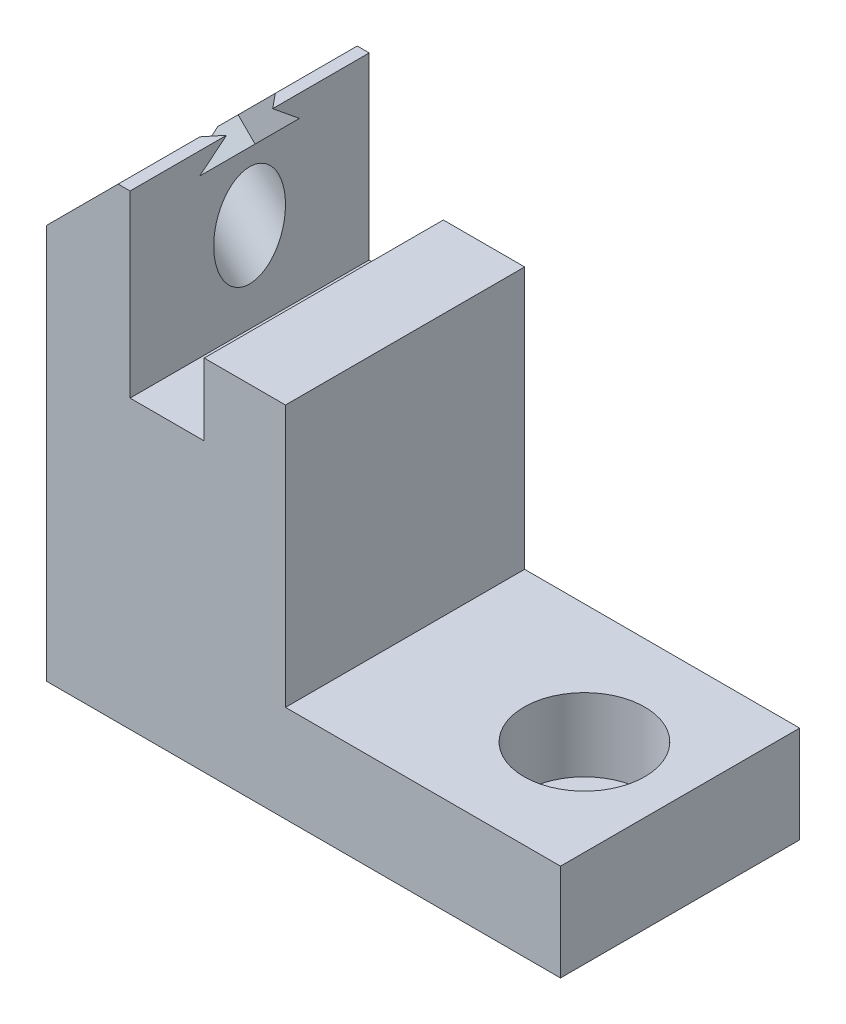
ISO-10303-21;
HEADER;
FILE_DESCRIPTION(('STEP AP214'),'2;1');
FILE_NAME('part.step','',(''),(''),'','','');
FILE_SCHEMA(('AUTOMOTIVE_DESIGN { 1 0 10303 214 1 1 1 1 }'));
ENDSEC;
DATA;
#1=APPLICATION_CONTEXT('core data for automotive mechanical design processes');
#2=APPLICATION_PROTOCOL_DEFINITION('international standard','automotive_design',2000,#1);
#3=PRODUCT_CONTEXT('',#1,'mechanical');
#4=PRODUCT('Part','Part','',(#3));
#5=PRODUCT_RELATED_PRODUCT_CATEGORY('part','',(#4));
#6=PRODUCT_DEFINITION_FORMATION('','',#4);
#7=PRODUCT_DEFINITION_CONTEXT('part definition',#1,'design');
#8=PRODUCT_DEFINITION('design','',#6,#7);
#9=PRODUCT_DEFINITION_SHAPE('','',#8);
#10=(LENGTH_UNIT() NAMED_UNIT(*) SI_UNIT(.MILLI.,.METRE.));
#11=(NAMED_UNIT(*) PLANE_ANGLE_UNIT() SI_UNIT($,.RADIAN.));
#12=(NAMED_UNIT(*) SI_UNIT($,.STERADIAN.) SOLID_ANGLE_UNIT());
#13=UNCERTAINTY_MEASURE_WITH_UNIT(LENGTH_MEASURE(1.E-05),#10,'distance_accuracy_value','');
#14=(GEOMETRIC_REPRESENTATION_CONTEXT(3) GLOBAL_UNCERTAINTY_ASSIGNED_CONTEXT((#13)) GLOBAL_UNIT_ASSIGNED_CONTEXT((#10,
#11,#12)) REPRESENTATION_CONTEXT('',''));
#15=CARTESIAN_POINT('',(0.,0.,0.));
#16=DIRECTION('',(0.,0.,1.));
#17=DIRECTION('',(1.,0.,0.));
#18=AXIS2_PLACEMENT_3D('',#15,#16,#17);
#19=CARTESIAN_POINT('',(25.,21.001,0.));
#20=DIRECTION('',(0.,-1.,0.));
#21=DIRECTION('',(0.,0.,-1.));
#22=AXIS2_PLACEMENT_3D('',#19,#20,#21);
#23=CYLINDRICAL_SURFACE('',#22,3.);
#24=CARTESIAN_POINT('',(25.,-18.,0.));
#25=DIRECTION('',(0.,-1.,0.));
#26=DIRECTION('',(0.,0.,-1.));
#27=AXIS2_PLACEMENT_3D('',#24,#25,#26);
#28=CIRCLE('',#27,3.);
#29=CARTESIAN_POINT('',(25.,-18.,-3.));
#30=VERTEX_POINT('',#29);
#31=EDGE_CURVE('E246',#30,#30,#28,.T.);
#32=ORIENTED_EDGE('',*,*,#31,.T.);
#33=EDGE_LOOP('',(#32));
#34=FACE_BOUND('',#33,.T.);
#35=CARTESIAN_POINT('',(25.,-16.,0.));
#36=DIRECTION('',(0.,1.,0.));
#37=DIRECTION('',(0.,0.,1.));
#38=AXIS2_PLACEMENT_3D('',#35,#36,#37);
#39=CIRCLE('',#38,3.);
#40=CARTESIAN_POINT('',(25.,-16.,3.));
#41=VERTEX_POINT('',#40);
#42=EDGE_CURVE('E43',#41,#41,#39,.F.);
#43=ORIENTED_EDGE('',*,*,#42,.F.);
#44=EDGE_LOOP('',(#43));
#45=FACE_BOUND('',#44,.T.);
#46=ADVANCED_FACE('F39',(#34,#45),#23,.F.);
#47=CARTESIAN_POINT('',(10.,6.,10.));
#48=DIRECTION('',(-1.,0.,0.));
#49=DIRECTION('',(0.,0.,1.));
#50=AXIS2_PLACEMENT_3D('',#47,#48,#49);
#51=PLANE('',#50);
#52=DIRECTION('',(0.,0.,1.));
#53=VECTOR('',#52,1.);
#54=CARTESIAN_POINT('',(10.,-9.9,10.));
#55=LINE('',#54,#53);
#56=CARTESIAN_POINT('',(10.,-9.9,-10.));
#57=VERTEX_POINT('',#56);
#58=CARTESIAN_POINT('',(10.,-9.9,10.));
#59=VERTEX_POINT('',#58);
#60=EDGE_CURVE('E57',#57,#59,#55,.T.);
#61=ORIENTED_EDGE('',*,*,#60,.F.);
#62=DIRECTION('',(0.,-1.,0.));
#63=VECTOR('',#62,1.);
#64=CARTESIAN_POINT('',(10.,6.,-10.));
#65=LINE('',#64,#63);
#66=CARTESIAN_POINT('',(10.,12.,-10.));
#67=VERTEX_POINT('',#66);
#68=EDGE_CURVE('E491',#67,#57,#65,.T.);
#69=ORIENTED_EDGE('',*,*,#68,.F.);
#70=DIRECTION('',(0.,0.,-1.));
#71=VECTOR('',#70,1.);
#72=CARTESIAN_POINT('',(10.,12.,10.));
#73=LINE('',#72,#71);
#74=CARTESIAN_POINT('',(10.,12.,10.));
#75=VERTEX_POINT('',#74);
#76=EDGE_CURVE('E459',#75,#67,#73,.T.);
#77=ORIENTED_EDGE('',*,*,#76,.F.);
#78=DIRECTION('',(0.,-1.,0.));
#79=VECTOR('',#78,1.);
#80=CARTESIAN_POINT('',(10.,6.,10.));
#81=LINE('',#80,#79);
#82=EDGE_CURVE('E483',#75,#59,#81,.T.);
#83=ORIENTED_EDGE('',*,*,#82,.T.);
#84=EDGE_LOOP('',(#61,#69,#77,#83));
#85=FACE_BOUND('',#84,.T.);
#86=ADVANCED_FACE('F532',(#85),#51,.F.);
#87=CARTESIAN_POINT('',(0.,21.,0.));
#88=DIRECTION('',(0.,-1.,0.));
#89=DIRECTION('',(0.,0.,-1.));
#90=AXIS2_PLACEMENT_3D('',#87,#88,#89);
#91=PLANE('',#90);
#92=DIRECTION('',(0.,0.,-1.));
#93=VECTOR('',#92,1.);
#94=CARTESIAN_POINT('',(-3.,21.,10.));
#95=LINE('',#94,#93);
#96=CARTESIAN_POINT('',(-3.,21.,10.));
#97=VERTEX_POINT('',#96);
#98=CARTESIAN_POINT('',(-3.,21.,1.92808109443833));
#99=VERTEX_POINT('',#98);
#100=EDGE_CURVE('E431',#97,#99,#95,.T.);
#101=ORIENTED_EDGE('',*,*,#100,.T.);
#102=DIRECTION('',(-0.632455532033677,0.,0.774596669241483));
#103=VECTOR('',#102,1.);
#104=CARTESIAN_POINT('',(-0.85543702718383,21.,-0.698461407894577));
#105=LINE('',#104,#103);
#106=CARTESIAN_POINT('',(-4.00000000000001,21.,3.15282596582992));
#107=VERTEX_POINT('',#106);
#108=EDGE_CURVE('E410',#99,#107,#105,.T.);
#109=ORIENTED_EDGE('',*,*,#108,.T.);
#110=DIRECTION('',(0.,0.,1.));
#111=VECTOR('',#110,1.);
#112=CARTESIAN_POINT('',(-4.00000000000001,21.,0.));
#113=LINE('',#112,#111);
#114=CARTESIAN_POINT('',(-4.00000000000001,21.,10.));
#115=VERTEX_POINT('',#114);
#116=EDGE_CURVE('E494',#107,#115,#113,.T.);
#117=ORIENTED_EDGE('',*,*,#116,.T.);
#118=DIRECTION('',(1.,0.,0.));
#119=VECTOR('',#118,1.);
#120=CARTESIAN_POINT('',(-10.,21.,10.));
#121=LINE('',#120,#119);
#122=EDGE_CURVE('E427',#115,#97,#121,.T.);
#123=ORIENTED_EDGE('',*,*,#122,.T.);
#124=EDGE_LOOP('',(#101,#109,#117,#123));
#125=FACE_BOUND('',#124,.T.);
#126=ADVANCED_FACE('F538',(#125),#91,.F.);
#127=CARTESIAN_POINT('',(-4.00000000000001,21.,0.));
#128=DIRECTION('',(0.707106781186549,-0.707106781186546,0.));
#129=DIRECTION('',(0.,0.,1.));
#130=AXIS2_PLACEMENT_3D('',#127,#128,#129);
#131=PLANE('',#130);
#132=DIRECTION('',(0.353553390593273,0.353553390593274,-0.866025403784439));
#133=VECTOR('',#132,1.);
#134=CARTESIAN_POINT('',(-4.97864220139431,20.0213577986057,5.55));
#135=LINE('',#134,#133);
#136=CARTESIAN_POINT('',(-4.97864220139431,20.0213577986057,5.55));
#137=VERTEX_POINT('',#136);
#138=EDGE_CURVE('E331',#137,#107,#135,.T.);
#139=ORIENTED_EDGE('',*,*,#138,.F.);
#140=DIRECTION('',(0.707106781186546,0.707106781186549,0.));
#141=VECTOR('',#140,1.);
#142=CARTESIAN_POINT('',(-9.51019822554318,15.4898017744568,5.55));
#143=LINE('',#142,#141);
#144=CARTESIAN_POINT('',(-9.51019822554318,15.4898017744568,5.55));
#145=VERTEX_POINT('',#144);
#146=EDGE_CURVE('E337',#145,#137,#143,.T.);
#147=ORIENTED_EDGE('',*,*,#146,.F.);
#148=DIRECTION('',(0.353553390593273,0.353553390593274,0.866025403784439));
#149=VECTOR('',#148,1.);
#150=CARTESIAN_POINT('',(-11.7759762376176,13.2240237623824,0.));
#151=LINE('',#150,#149);
#152=CARTESIAN_POINT('',(-10.,15.,4.350235577471));
#153=VERTEX_POINT('',#152);
#154=EDGE_CURVE('E368',#153,#145,#151,.T.);
#155=ORIENTED_EDGE('',*,*,#154,.F.);
#156=DIRECTION('',(0.,0.,-1.));
#157=VECTOR('',#156,1.);
#158=CARTESIAN_POINT('',(-10.,15.,10.));
#159=LINE('',#158,#157);
#160=CARTESIAN_POINT('',(-10.,15.,10.));
#161=VERTEX_POINT('',#160);
#162=EDGE_CURVE('E49',#161,#153,#159,.T.);
#163=ORIENTED_EDGE('',*,*,#162,.F.);
#164=DIRECTION('',(0.707106781186546,0.707106781186549,0.));
#165=VECTOR('',#164,1.);
#166=CARTESIAN_POINT('',(-4.00000000000001,21.,10.));
#167=LINE('',#166,#165);
#168=EDGE_CURVE('E499',#115,#161,#167,.F.);
#169=ORIENTED_EDGE('',*,*,#168,.F.);
#170=ORIENTED_EDGE('',*,*,#116,.F.);
#171=EDGE_LOOP('',(#139,#147,#155,#163,#169,#170));
#172=FACE_BOUND('',#171,.T.);
#173=ADVANCED_FACE('F770',(#172),#131,.F.);
#174=CARTESIAN_POINT('',(-0.173352401603255,10.6845119746658,0.));
#175=DIRECTION('',(-0.707106781186549,0.707106781186546,0.));
#176=DIRECTION('',(-0.707106781186546,-0.707106781186549,0.));
#177=AXIS2_PLACEMENT_3D('',#174,#175,#176);
#178=CYLINDRICAL_SURFACE('',#177,3.);
#179=CARTESIAN_POINT('',(-3.,13.5111595730625,0.));
#180=DIRECTION('',(-1.,0.,0.));
#181=DIRECTION('',(0.,1.,0.));
#182=AXIS2_PLACEMENT_3D('',#179,#180,#181);
#183=ELLIPSE('',#182,4.24264068711928,3.);
#184=CARTESIAN_POINT('',(-3.,17.7538002601818,0.));
#185=VERTEX_POINT('',#184);
#186=EDGE_CURVE('E227',#185,#185,#183,.T.);
#187=ORIENTED_EDGE('',*,*,#186,.F.);
#188=EDGE_LOOP('',(#187));
#189=FACE_BOUND('',#188,.T.);
#190=CARTESIAN_POINT('',(-5.83020665109565,16.3413662241582,0.));
#191=DIRECTION('',(-0.707106781186549,0.707106781186546,0.));
#192=DIRECTION('',(-0.707106781186546,-0.707106781186549,0.));
#193=AXIS2_PLACEMENT_3D('',#190,#191,#192);
#194=CIRCLE('',#193,3.);
#195=CARTESIAN_POINT('',(-7.95152699465529,14.2200458805985,0.));
#196=VERTEX_POINT('',#195);
#197=EDGE_CURVE('E377',#196,#196,#194,.F.);
#198=ORIENTED_EDGE('',*,*,#197,.F.);
#199=EDGE_LOOP('',(#198));
#200=FACE_BOUND('',#199,.T.);
#201=ADVANCED_FACE('F820',(#189,#200),#178,.F.);
#202=CARTESIAN_POINT('',(0.,6.,0.));
#203=DIRECTION('',(0.,-1.,0.));
#204=DIRECTION('',(0.,0.,-1.));
#205=AXIS2_PLACEMENT_3D('',#202,#203,#204);
#206=PLANE('',#205);
#207=DIRECTION('',(0.,0.,-1.));
#208=VECTOR('',#207,1.);
#209=CARTESIAN_POINT('',(-3.,6.,10.));
#210=LINE('',#209,#208);
#211=CARTESIAN_POINT('',(-3.,6.,10.));
#212=VERTEX_POINT('',#211);
#213=CARTESIAN_POINT('',(-3.,6.,-10.));
#214=VERTEX_POINT('',#213);
#215=EDGE_CURVE('E426',#212,#214,#210,.T.);
#216=ORIENTED_EDGE('',*,*,#215,.F.);
#217=DIRECTION('',(1.,0.,0.));
#218=VECTOR('',#217,1.);
#219=CARTESIAN_POINT('',(-10.,6.,10.));
#220=LINE('',#219,#218);
#221=CARTESIAN_POINT('',(3.2,6.,10.));
#222=VERTEX_POINT('',#221);
#223=EDGE_CURVE('E480',#212,#222,#220,.T.);
#224=ORIENTED_EDGE('',*,*,#223,.T.);
#225=DIRECTION('',(0.,0.,1.));
#226=VECTOR('',#225,1.);
#227=CARTESIAN_POINT('',(3.2,6.,10.));
#228=LINE('',#227,#226);
#229=CARTESIAN_POINT('',(3.2,6.,-10.));
#230=VERTEX_POINT('',#229);
#231=EDGE_CURVE('E450',#230,#222,#228,.T.);
#232=ORIENTED_EDGE('',*,*,#231,.F.);
#233=DIRECTION('',(-1.,0.,0.));
#234=VECTOR('',#233,1.);
#235=CARTESIAN_POINT('',(-10.,6.,-10.));
#236=LINE('',#235,#234);
#237=EDGE_CURVE('E477',#230,#214,#236,.T.);
#238=ORIENTED_EDGE('',*,*,#237,.T.);
#239=EDGE_LOOP('',(#216,#224,#232,#238));
#240=FACE_BOUND('',#239,.T.);
#241=ADVANCED_FACE('F649',(#240),#206,.F.);
#242=CARTESIAN_POINT('',(-10.,6.,-10.));
#243=DIRECTION('',(0.,0.,1.));
#244=DIRECTION('',(1.,0.,0.));
#245=AXIS2_PLACEMENT_3D('',#242,#243,#244);
#246=PLANE('',#245);
#247=DIRECTION('',(0.,-1.,0.));
#248=VECTOR('',#247,1.);
#249=CARTESIAN_POINT('',(-10.,6.,-10.));
#250=LINE('',#249,#248);
#251=CARTESIAN_POINT('',(-10.,15.,-10.));
#252=VERTEX_POINT('',#251);
#253=CARTESIAN_POINT('',(-10.,-18.,-10.));
#254=VERTEX_POINT('',#253);
#255=EDGE_CURVE('E488',#252,#254,#250,.T.);
#256=ORIENTED_EDGE('',*,*,#255,.F.);
#257=DIRECTION('',(-0.707106781186546,-0.707106781186549,0.));
#258=VECTOR('',#257,1.);
#259=CARTESIAN_POINT('',(-4.00000000000001,21.,-10.));
#260=LINE('',#259,#258);
#261=CARTESIAN_POINT('',(-4.00000000000001,21.,-10.));
#262=VERTEX_POINT('',#261);
#263=EDGE_CURVE('E11',#252,#262,#260,.F.);
#264=ORIENTED_EDGE('',*,*,#263,.T.);
#265=DIRECTION('',(-1.,0.,0.));
#266=VECTOR('',#265,1.);
#267=CARTESIAN_POINT('',(-10.,21.,-10.));
#268=LINE('',#267,#266);
#269=CARTESIAN_POINT('',(-3.,21.,-10.));
#270=VERTEX_POINT('',#269);
#271=EDGE_CURVE('E435',#270,#262,#268,.T.);
#272=ORIENTED_EDGE('',*,*,#271,.F.);
#273=DIRECTION('',(0.,-1.,0.));
#274=VECTOR('',#273,1.);
#275=CARTESIAN_POINT('',(-3.,21.,-10.));
#276=LINE('',#275,#274);
#277=EDGE_CURVE('E439',#270,#214,#276,.T.);
#278=ORIENTED_EDGE('',*,*,#277,.T.);
#279=ORIENTED_EDGE('',*,*,#237,.F.);
#280=DIRECTION('',(0.,-1.,0.));
#281=VECTOR('',#280,1.);
#282=CARTESIAN_POINT('',(3.2,12.,-10.));
#283=LINE('',#282,#281);
#284=CARTESIAN_POINT('',(3.2,12.,-10.));
#285=VERTEX_POINT('',#284);
#286=EDGE_CURVE('E466',#285,#230,#283,.T.);
#287=ORIENTED_EDGE('',*,*,#286,.F.);
#288=DIRECTION('',(-1.,0.,0.));
#289=VECTOR('',#288,1.);
#290=CARTESIAN_POINT('',(3.2,12.,-10.));
#291=LINE('',#290,#289);
#292=EDGE_CURVE('E463',#67,#285,#291,.T.);
#293=ORIENTED_EDGE('',*,*,#292,.F.);
#294=ORIENTED_EDGE('',*,*,#68,.T.);
#295=DIRECTION('',(-1.,0.,0.));
#296=VECTOR('',#295,1.);
#297=CARTESIAN_POINT('',(33.,-9.9,-10.));
#298=LINE('',#297,#296);
#299=CARTESIAN_POINT('',(33.,-9.9,-10.));
#300=VERTEX_POINT('',#299);
#301=EDGE_CURVE('E258',#300,#57,#298,.T.);
#302=ORIENTED_EDGE('',*,*,#301,.F.);
#303=DIRECTION('',(0.,1.,0.));
#304=VECTOR('',#303,1.);
#305=CARTESIAN_POINT('',(33.,-18.,-10.));
#306=LINE('',#305,#304);
#307=CARTESIAN_POINT('',(33.,-18.,-10.));
#308=VERTEX_POINT('',#307);
#309=EDGE_CURVE('E237',#308,#300,#306,.T.);
#310=ORIENTED_EDGE('',*,*,#309,.F.);
#311=DIRECTION('',(1.,0.,0.));
#312=VECTOR('',#311,1.);
#313=CARTESIAN_POINT('',(10.,-18.,-10.));
#314=LINE('',#313,#312);
#315=EDGE_CURVE('E228',#254,#308,#314,.T.);
#316=ORIENTED_EDGE('',*,*,#315,.F.);
#317=EDGE_LOOP('',(#256,#264,#272,#278,#279,#287,#293,#294,#302,#310,#316));
#318=FACE_BOUND('',#317,.T.);
#319=ADVANCED_FACE('F642',(#318),#246,.F.);
#320=CARTESIAN_POINT('',(-10.,6.,10.));
#321=DIRECTION('',(1.,0.,0.));
#322=DIRECTION('',(0.,0.,-1.));
#323=AXIS2_PLACEMENT_3D('',#320,#321,#322);
#324=PLANE('',#323);
#325=ORIENTED_EDGE('',*,*,#162,.T.);
#326=DIRECTION('',(0.,-0.632455532033675,-0.774596669241484));
#327=VECTOR('',#326,1.);
#328=CARTESIAN_POINT('',(-10.,14.1678080004252,3.33101269397869));
#329=LINE('',#328,#327);
#330=CARTESIAN_POINT('',(-10.,12.1715728752538,0.886133962333245));
#331=VERTEX_POINT('',#330);
#332=EDGE_CURVE('E406',#153,#331,#329,.T.);
#333=ORIENTED_EDGE('',*,*,#332,.T.);
#334=DIRECTION('',(0.,0.,1.));
#335=VECTOR('',#334,1.);
#336=CARTESIAN_POINT('',(-10.,12.1715728752538,10.));
#337=LINE('',#336,#335);
#338=CARTESIAN_POINT('',(-10.,12.1715728752538,-0.886133962333247));
#339=VERTEX_POINT('',#338);
#340=EDGE_CURVE('E391',#339,#331,#337,.T.);
#341=ORIENTED_EDGE('',*,*,#340,.F.);
#342=DIRECTION('',(0.,0.632455532033675,-0.774596669241484));
#343=VECTOR('',#342,1.);
#344=CARTESIAN_POINT('',(-10.,4.36984902929251,8.66898730602132));
#345=LINE('',#344,#343);
#346=CARTESIAN_POINT('',(-10.,15.,-4.350235577471));
#347=VERTEX_POINT('',#346);
#348=EDGE_CURVE('E402',#339,#347,#345,.T.);
#349=ORIENTED_EDGE('',*,*,#348,.T.);
#350=EDGE_CURVE('E502',#347,#252,#159,.T.);
#351=ORIENTED_EDGE('',*,*,#350,.T.);
#352=ORIENTED_EDGE('',*,*,#255,.T.);
#353=DIRECTION('',(0.,0.,-1.));
#354=VECTOR('',#353,1.);
#355=CARTESIAN_POINT('',(-10.,-18.,-10.));
#356=LINE('',#355,#354);
#357=CARTESIAN_POINT('',(-10.,-18.,10.));
#358=VERTEX_POINT('',#357);
#359=EDGE_CURVE('E418',#358,#254,#356,.T.);
#360=ORIENTED_EDGE('',*,*,#359,.F.);
#361=DIRECTION('',(0.,-1.,0.));
#362=VECTOR('',#361,1.);
#363=CARTESIAN_POINT('',(-10.,6.,10.));
#364=LINE('',#363,#362);
#365=EDGE_CURVE('E222',#161,#358,#364,.T.);
#366=ORIENTED_EDGE('',*,*,#365,.F.);
#367=EDGE_LOOP('',(#325,#333,#341,#349,#351,#352,#360,#366));
#368=FACE_BOUND('',#367,.T.);
#369=ADVANCED_FACE('F648',(#368),#324,.F.);
#370=CARTESIAN_POINT('',(-10.,6.,10.));
#371=DIRECTION('',(0.,0.,-1.));
#372=DIRECTION('',(-1.,0.,0.));
#373=AXIS2_PLACEMENT_3D('',#370,#371,#372);
#374=PLANE('',#373);
#375=ORIENTED_EDGE('',*,*,#122,.F.);
#376=ORIENTED_EDGE('',*,*,#168,.T.);
#377=ORIENTED_EDGE('',*,*,#365,.T.);
#378=DIRECTION('',(-1.,0.,0.));
#379=VECTOR('',#378,1.);
#380=CARTESIAN_POINT('',(10.,-18.,10.));
#381=LINE('',#380,#379);
#382=CARTESIAN_POINT('',(33.,-18.,10.));
#383=VERTEX_POINT('',#382);
#384=EDGE_CURVE('E214',#383,#358,#381,.T.);
#385=ORIENTED_EDGE('',*,*,#384,.F.);
#386=DIRECTION('',(0.,-1.,0.));
#387=VECTOR('',#386,1.);
#388=CARTESIAN_POINT('',(33.,-18.,10.));
#389=LINE('',#388,#387);
#390=CARTESIAN_POINT('',(33.,-9.9,10.));
#391=VERTEX_POINT('',#390);
#392=EDGE_CURVE('E220',#391,#383,#389,.T.);
#393=ORIENTED_EDGE('',*,*,#392,.F.);
#394=DIRECTION('',(-1.,0.,0.));
#395=VECTOR('',#394,1.);
#396=CARTESIAN_POINT('',(33.,-9.9,10.));
#397=LINE('',#396,#395);
#398=EDGE_CURVE('E254',#391,#59,#397,.T.);
#399=ORIENTED_EDGE('',*,*,#398,.T.);
#400=ORIENTED_EDGE('',*,*,#82,.F.);
#401=DIRECTION('',(1.,0.,0.));
#402=VECTOR('',#401,1.);
#403=CARTESIAN_POINT('',(3.2,12.,10.));
#404=LINE('',#403,#402);
#405=CARTESIAN_POINT('',(3.2,12.,10.));
#406=VERTEX_POINT('',#405);
#407=EDGE_CURVE('E455',#406,#75,#404,.T.);
#408=ORIENTED_EDGE('',*,*,#407,.F.);
#409=DIRECTION('',(0.,-1.,0.));
#410=VECTOR('',#409,1.);
#411=CARTESIAN_POINT('',(3.2,12.,10.));
#412=LINE('',#411,#410);
#413=EDGE_CURVE('E473',#406,#222,#412,.T.);
#414=ORIENTED_EDGE('',*,*,#413,.T.);
#415=ORIENTED_EDGE('',*,*,#223,.F.);
#416=DIRECTION('',(0.,-1.,0.));
#417=VECTOR('',#416,1.);
#418=CARTESIAN_POINT('',(-3.,21.,10.));
#419=LINE('',#418,#417);
#420=EDGE_CURVE('E446',#97,#212,#419,.T.);
#421=ORIENTED_EDGE('',*,*,#420,.F.);
#422=EDGE_LOOP('',(#375,#376,#377,#385,#393,#399,#400,#408,#414,#415,#421));
#423=FACE_BOUND('',#422,.T.);
#424=ADVANCED_FACE('F217',(#423),#374,.F.);
#425=CARTESIAN_POINT('',(3.2,12.,10.));
#426=DIRECTION('',(1.,0.,0.));
#427=DIRECTION('',(0.,0.,-1.));
#428=AXIS2_PLACEMENT_3D('',#425,#426,#427);
#429=PLANE('',#428);
#430=ORIENTED_EDGE('',*,*,#231,.T.);
#431=ORIENTED_EDGE('',*,*,#413,.F.);
#432=DIRECTION('',(0.,0.,1.));
#433=VECTOR('',#432,1.);
#434=CARTESIAN_POINT('',(3.2,12.,10.));
#435=LINE('',#434,#433);
#436=EDGE_CURVE('E451',#285,#406,#435,.T.);
#437=ORIENTED_EDGE('',*,*,#436,.F.);
#438=ORIENTED_EDGE('',*,*,#286,.T.);
#439=EDGE_LOOP('',(#430,#431,#437,#438));
#440=FACE_BOUND('',#439,.T.);
#441=ADVANCED_FACE('F664',(#440),#429,.F.);
#442=CARTESIAN_POINT('',(0.,12.,0.));
#443=DIRECTION('',(0.,-1.,0.));
#444=DIRECTION('',(0.,0.,-1.));
#445=AXIS2_PLACEMENT_3D('',#442,#443,#444);
#446=PLANE('',#445);
#447=ORIENTED_EDGE('',*,*,#436,.T.);
#448=ORIENTED_EDGE('',*,*,#407,.T.);
#449=ORIENTED_EDGE('',*,*,#76,.T.);
#450=ORIENTED_EDGE('',*,*,#292,.T.);
#451=EDGE_LOOP('',(#447,#448,#449,#450));
#452=FACE_BOUND('',#451,.T.);
#453=ADVANCED_FACE('F746',(#452),#446,.F.);
#454=CARTESIAN_POINT('',(-3.,21.,10.));
#455=DIRECTION('',(-1.,0.,0.));
#456=DIRECTION('',(0.,0.,1.));
#457=AXIS2_PLACEMENT_3D('',#454,#455,#456);
#458=PLANE('',#457);
#459=ORIENTED_EDGE('',*,*,#186,.T.);
#460=EDGE_LOOP('',(#459));
#461=FACE_BOUND('',#460,.T.);
#462=DIRECTION('',(0.,0.,-1.));
#463=VECTOR('',#462,1.);
#464=CARTESIAN_POINT('',(-3.,19.1715728752538,10.));
#465=LINE('',#464,#463);
#466=CARTESIAN_POINT('',(-3.,19.1715728752538,4.16743783818448));
#467=VERTEX_POINT('',#466);
#468=CARTESIAN_POINT('',(-3.,19.1715728752538,-4.16743783818448));
#469=VERTEX_POINT('',#468);
#470=EDGE_CURVE('E388',#467,#469,#465,.T.);
#471=ORIENTED_EDGE('',*,*,#470,.F.);
#472=DIRECTION('',(0.,0.632455532033675,-0.774596669241484));
#473=VECTOR('',#472,1.);
#474=CARTESIAN_POINT('',(-3.,17.0455834872498,6.77123243777534));
#475=LINE('',#474,#473);
#476=EDGE_CURVE('E414',#467,#99,#475,.T.);
#477=ORIENTED_EDGE('',*,*,#476,.T.);
#478=ORIENTED_EDGE('',*,*,#100,.F.);
#479=ORIENTED_EDGE('',*,*,#420,.T.);
#480=ORIENTED_EDGE('',*,*,#215,.T.);
#481=ORIENTED_EDGE('',*,*,#277,.F.);
#482=CARTESIAN_POINT('',(-3.,21.,-1.92808109443833));
#483=VERTEX_POINT('',#482);
#484=EDGE_CURVE('E430',#483,#270,#95,.T.);
#485=ORIENTED_EDGE('',*,*,#484,.F.);
#486=DIRECTION('',(0.,-0.632455532033676,-0.774596669241484));
#487=VECTOR('',#486,1.);
#488=CARTESIAN_POINT('',(-3.,26.8435424583825,5.22876756222467));
#489=LINE('',#488,#487);
#490=EDGE_CURVE('E398',#483,#469,#489,.T.);
#491=ORIENTED_EDGE('',*,*,#490,.T.);
#492=EDGE_LOOP('',(#471,#477,#478,#479,#480,#481,#485,#491));
#493=FACE_BOUND('',#492,.T.);
#494=ADVANCED_FACE('F761',(#461,#493),#458,.F.);
#495=CARTESIAN_POINT('',(-4.00000000000001,21.,-3.15282596582992));
#496=VERTEX_POINT('',#495);
#497=EDGE_CURVE('E495',#262,#496,#113,.T.);
#498=ORIENTED_EDGE('',*,*,#497,.T.);
#499=DIRECTION('',(0.632455532033677,0.,0.774596669241483));
#500=VECTOR('',#499,1.);
#501=CARTESIAN_POINT('',(-0.855437027183828,21.,0.698461407894576));
#502=LINE('',#501,#500);
#503=EDGE_CURVE('E394',#496,#483,#502,.T.);
#504=ORIENTED_EDGE('',*,*,#503,.T.);
#505=ORIENTED_EDGE('',*,*,#484,.T.);
#506=ORIENTED_EDGE('',*,*,#271,.T.);
#507=EDGE_LOOP('',(#498,#504,#505,#506));
#508=FACE_BOUND('',#507,.T.);
#509=ADVANCED_FACE('F796',(#508),#91,.F.);
#510=DIRECTION('',(-0.353553390593273,-0.353553390593274,0.866025403784439));
#511=VECTOR('',#510,1.);
#512=CARTESIAN_POINT('',(-9.51019822554318,15.4898017744568,-5.55));
#513=LINE('',#512,#511);
#514=CARTESIAN_POINT('',(-9.51019822554318,15.4898017744568,-5.55));
#515=VERTEX_POINT('',#514);
#516=EDGE_CURVE('E365',#515,#347,#513,.T.);
#517=ORIENTED_EDGE('',*,*,#516,.F.);
#518=DIRECTION('',(-0.707106781186546,-0.707106781186549,0.));
#519=VECTOR('',#518,1.);
#520=CARTESIAN_POINT('',(-4.97864220139431,20.0213577986057,-5.55));
#521=LINE('',#520,#519);
#522=CARTESIAN_POINT('',(-4.97864220139431,20.0213577986057,-5.55));
#523=VERTEX_POINT('',#522);
#524=EDGE_CURVE('E361',#523,#515,#521,.T.);
#525=ORIENTED_EDGE('',*,*,#524,.F.);
#526=DIRECTION('',(-0.353553390593273,-0.353553390593275,-0.866025403784439));
#527=VECTOR('',#526,1.);
#528=CARTESIAN_POINT('',(-2.71286418931987,22.2871358106801,0.));
#529=LINE('',#528,#527);
#530=EDGE_CURVE('E358',#496,#523,#529,.T.);
#531=ORIENTED_EDGE('',*,*,#530,.F.);
#532=ORIENTED_EDGE('',*,*,#497,.F.);
#533=ORIENTED_EDGE('',*,*,#263,.F.);
#534=ORIENTED_EDGE('',*,*,#350,.F.);
#535=EDGE_LOOP('',(#517,#525,#531,#532,#533,#534));
#536=FACE_BOUND('',#535,.T.);
#537=ADVANCED_FACE('F41',(#536),#131,.F.);
#538=CARTESIAN_POINT('',(0.,-18.,0.));
#539=DIRECTION('',(0.,-1.,0.));
#540=DIRECTION('',(0.,0.,-1.));
#541=AXIS2_PLACEMENT_3D('',#538,#539,#540);
#542=PLANE('',#541);
#543=ORIENTED_EDGE('',*,*,#31,.F.);
#544=EDGE_LOOP('',(#543));
#545=FACE_BOUND('',#544,.T.);
#546=DIRECTION('',(-0.867964050699415,0.,-0.496627029765259));
#547=VECTOR('',#546,1.);
#548=CARTESIAN_POINT('',(0.022910467620127,-18.,5.88892818010828));
#549=LINE('',#548,#547);
#550=CARTESIAN_POINT('',(0.022910467620127,-18.,5.88892818010828));
#551=VERTEX_POINT('',#550);
#552=CARTESIAN_POINT('',(-5.08850617122577,-18.,2.96430513702575));
#553=VERTEX_POINT('',#552);
#554=EDGE_CURVE('E65',#551,#553,#549,.T.);
#555=ORIENTED_EDGE('',*,*,#554,.F.);
#556=DIRECTION('',(-0.864073649332432,0.,0.503365402594708));
#557=VECTOR('',#556,1.);
#558=CARTESIAN_POINT('',(5.1114166388459,-18.,2.92462304308253));
#559=LINE('',#558,#557);
#560=CARTESIAN_POINT('',(5.1114166388459,-18.,2.92462304308253));
#561=VERTEX_POINT('',#560);
#562=EDGE_CURVE('E267',#561,#551,#559,.T.);
#563=ORIENTED_EDGE('',*,*,#562,.F.);
#564=DIRECTION('',(0.00389040136698247,0.,0.999992432359967));
#565=VECTOR('',#564,1.);
#566=CARTESIAN_POINT('',(5.08850617122577,-18.,-2.96430513702575));
#567=LINE('',#566,#565);
#568=CARTESIAN_POINT('',(5.08850617122577,-18.,-2.96430513702575));
#569=VERTEX_POINT('',#568);
#570=EDGE_CURVE('E302',#569,#561,#567,.T.);
#571=ORIENTED_EDGE('',*,*,#570,.F.);
#572=DIRECTION('',(0.867964050699415,0.,0.496627029765259));
#573=VECTOR('',#572,1.);
#574=CARTESIAN_POINT('',(-0.0229104676201268,-18.,-5.88892818010828));
#575=LINE('',#574,#573);
#576=CARTESIAN_POINT('',(-0.0229104676201268,-18.,-5.88892818010828));
#577=VERTEX_POINT('',#576);
#578=EDGE_CURVE('E298',#577,#569,#575,.T.);
#579=ORIENTED_EDGE('',*,*,#578,.F.);
#580=DIRECTION('',(0.864073649332432,0.,-0.503365402594708));
#581=VECTOR('',#580,1.);
#582=CARTESIAN_POINT('',(-5.1114166388459,-18.,-2.92462304308253));
#583=LINE('',#582,#581);
#584=CARTESIAN_POINT('',(-5.1114166388459,-18.,-2.92462304308253));
#585=VERTEX_POINT('',#584);
#586=EDGE_CURVE('E294',#585,#577,#583,.T.);
#587=ORIENTED_EDGE('',*,*,#586,.F.);
#588=DIRECTION('',(-0.00389040136698232,0.,-0.999992432359967));
#589=VECTOR('',#588,1.);
#590=CARTESIAN_POINT('',(-5.08850617122577,-18.,2.96430513702575));
#591=LINE('',#590,#589);
#592=EDGE_CURVE('E290',#553,#585,#591,.T.);
#593=ORIENTED_EDGE('',*,*,#592,.F.);
#594=EDGE_LOOP('',(#555,#563,#571,#579,#587,#593));
#595=FACE_BOUND('',#594,.T.);
#596=ORIENTED_EDGE('',*,*,#359,.T.);
#597=ORIENTED_EDGE('',*,*,#315,.T.);
#598=DIRECTION('',(0.,0.,-1.));
#599=VECTOR('',#598,1.);
#600=CARTESIAN_POINT('',(33.,-18.,10.));
#601=LINE('',#600,#599);
#602=EDGE_CURVE('E231',#383,#308,#601,.T.);
#603=ORIENTED_EDGE('',*,*,#602,.F.);
#604=ORIENTED_EDGE('',*,*,#384,.T.);
#605=EDGE_LOOP('',(#596,#597,#603,#604));
#606=FACE_BOUND('',#605,.T.);
#607=ADVANCED_FACE('F232',(#545,#595,#606),#542,.T.);
#608=CARTESIAN_POINT('',(-3.56442863902121,18.6071442362326,5.55));
#609=DIRECTION('',(0.612372435695793,0.612372435695796,0.5));
#610=DIRECTION('',(-0.707106781186549,0.707106781186546,0.));
#611=AXIS2_PLACEMENT_3D('',#608,#609,#610);
#612=PLANE('',#611);
#613=DIRECTION('',(0.353553390593273,0.353553390593274,-0.866025403784439));
#614=VECTOR('',#613,1.);
#615=CARTESIAN_POINT('',(-3.56442863902121,18.6071442362326,5.55));
#616=LINE('',#615,#614);
#617=CARTESIAN_POINT('',(-3.56442863902121,18.6071442362326,5.55));
#618=VERTEX_POINT('',#617);
#619=EDGE_CURVE('E332',#618,#467,#616,.T.);
#620=ORIENTED_EDGE('',*,*,#619,.F.);
#621=DIRECTION('',(-0.707106781186549,0.707106781186546,0.));
#622=VECTOR('',#621,1.);
#623=CARTESIAN_POINT('',(-3.56442863902121,18.6071442362326,5.55));
#624=LINE('',#623,#622);
#625=EDGE_CURVE('E374',#618,#137,#624,.T.);
#626=ORIENTED_EDGE('',*,*,#625,.T.);
#627=ORIENTED_EDGE('',*,*,#138,.T.);
#628=ORIENTED_EDGE('',*,*,#108,.F.);
#629=ORIENTED_EDGE('',*,*,#476,.F.);
#630=EDGE_LOOP('',(#620,#626,#627,#628,#629));
#631=FACE_BOUND('',#630,.T.);
#632=ADVANCED_FACE('F677',(#631),#612,.F.);
#633=CARTESIAN_POINT('',(-10.3617626752445,11.8098102000093,0.));
#634=DIRECTION('',(-0.612372435695793,-0.612372435695796,0.5));
#635=DIRECTION('',(0.707106781186549,-0.707106781186546,0.));
#636=AXIS2_PLACEMENT_3D('',#633,#634,#635);
#637=PLANE('',#636);
#638=ORIENTED_EDGE('',*,*,#154,.T.);
#639=DIRECTION('',(-0.707106781186549,0.707106781186546,0.));
#640=VECTOR('',#639,1.);
#641=CARTESIAN_POINT('',(-8.09598466317008,14.0755882120837,5.55));
#642=LINE('',#641,#640);
#643=CARTESIAN_POINT('',(-8.09598466317008,14.0755882120837,5.55));
#644=VERTEX_POINT('',#643);
#645=EDGE_CURVE('E378',#644,#145,#642,.T.);
#646=ORIENTED_EDGE('',*,*,#645,.F.);
#647=DIRECTION('',(0.353553390593273,0.353553390593274,0.866025403784439));
#648=VECTOR('',#647,1.);
#649=CARTESIAN_POINT('',(-10.3617626752445,11.8098102000093,0.));
#650=LINE('',#649,#648);
#651=EDGE_CURVE('E348',#331,#644,#650,.T.);
#652=ORIENTED_EDGE('',*,*,#651,.F.);
#653=ORIENTED_EDGE('',*,*,#332,.F.);
#654=EDGE_LOOP('',(#638,#646,#652,#653));
#655=FACE_BOUND('',#654,.T.);
#656=ADVANCED_FACE('F774',(#655),#637,.F.);
#657=CARTESIAN_POINT('',(-8.09598466317008,14.0755882120837,-5.55));
#658=DIRECTION('',(-0.612372435695793,-0.612372435695796,-0.5));
#659=DIRECTION('',(0.707106781186549,-0.707106781186546,0.));
#660=AXIS2_PLACEMENT_3D('',#657,#658,#659);
#661=PLANE('',#660);
#662=DIRECTION('',(-0.353553390593273,-0.353553390593274,0.866025403784439));
#663=VECTOR('',#662,1.);
#664=CARTESIAN_POINT('',(-8.09598466317008,14.0755882120837,-5.55));
#665=LINE('',#664,#663);
#666=CARTESIAN_POINT('',(-8.09598466317008,14.0755882120837,-5.55));
#667=VERTEX_POINT('',#666);
#668=EDGE_CURVE('E344',#667,#339,#665,.T.);
#669=ORIENTED_EDGE('',*,*,#668,.F.);
#670=DIRECTION('',(-0.707106781186549,0.707106781186546,0.));
#671=VECTOR('',#670,1.);
#672=CARTESIAN_POINT('',(-8.09598466317008,14.0755882120837,-5.55));
#673=LINE('',#672,#671);
#674=EDGE_CURVE('E382',#667,#515,#673,.T.);
#675=ORIENTED_EDGE('',*,*,#674,.T.);
#676=ORIENTED_EDGE('',*,*,#516,.T.);
#677=ORIENTED_EDGE('',*,*,#348,.F.);
#678=EDGE_LOOP('',(#669,#675,#676,#677));
#679=FACE_BOUND('',#678,.T.);
#680=ADVANCED_FACE('F805',(#679),#661,.F.);
#681=CARTESIAN_POINT('',(-1.29865062694677,20.8729222483071,0.));
#682=DIRECTION('',(0.612372435695793,0.612372435695795,-0.5));
#683=DIRECTION('',(-0.707106781186549,0.707106781186546,0.));
#684=AXIS2_PLACEMENT_3D('',#681,#682,#683);
#685=PLANE('',#684);
#686=ORIENTED_EDGE('',*,*,#503,.F.);
#687=ORIENTED_EDGE('',*,*,#530,.T.);
#688=DIRECTION('',(-0.707106781186549,0.707106781186546,0.));
#689=VECTOR('',#688,1.);
#690=CARTESIAN_POINT('',(-3.56442863902121,18.6071442362326,-5.55));
#691=LINE('',#690,#689);
#692=CARTESIAN_POINT('',(-3.56442863902121,18.6071442362326,-5.55));
#693=VERTEX_POINT('',#692);
#694=EDGE_CURVE('E355',#693,#523,#691,.T.);
#695=ORIENTED_EDGE('',*,*,#694,.F.);
#696=DIRECTION('',(-0.353553390593273,-0.353553390593275,-0.866025403784439));
#697=VECTOR('',#696,1.);
#698=CARTESIAN_POINT('',(-1.29865062694677,20.8729222483071,0.));
#699=LINE('',#698,#697);
#700=EDGE_CURVE('E336',#469,#693,#699,.T.);
#701=ORIENTED_EDGE('',*,*,#700,.F.);
#702=ORIENTED_EDGE('',*,*,#490,.F.);
#703=EDGE_LOOP('',(#686,#687,#695,#701,#702));
#704=FACE_BOUND('',#703,.T.);
#705=ADVANCED_FACE('F800',(#704),#685,.F.);
#706=CARTESIAN_POINT('',(-11.0857864376269,11.0857864376269,0.));
#707=DIRECTION('',(-0.707106781186549,0.707106781186546,0.));
#708=DIRECTION('',(-0.707106781186546,-0.707106781186549,0.));
#709=AXIS2_PLACEMENT_3D('',#706,#707,#708);
#710=PLANE('',#709);
#711=ORIENTED_EDGE('',*,*,#197,.T.);
#712=EDGE_LOOP('',(#711));
#713=FACE_BOUND('',#712,.T.);
#714=ORIENTED_EDGE('',*,*,#340,.T.);
#715=ORIENTED_EDGE('',*,*,#651,.T.);
#716=DIRECTION('',(0.707106781186546,0.707106781186549,0.));
#717=VECTOR('',#716,1.);
#718=CARTESIAN_POINT('',(-8.09598466317008,14.0755882120837,5.55));
#719=LINE('',#718,#717);
#720=EDGE_CURVE('E351',#644,#618,#719,.T.);
#721=ORIENTED_EDGE('',*,*,#720,.T.);
#722=ORIENTED_EDGE('',*,*,#619,.T.);
#723=ORIENTED_EDGE('',*,*,#470,.T.);
#724=ORIENTED_EDGE('',*,*,#700,.T.);
#725=DIRECTION('',(-0.707106781186546,-0.707106781186549,0.));
#726=VECTOR('',#725,1.);
#727=CARTESIAN_POINT('',(-3.56442863902121,18.6071442362326,-5.55));
#728=LINE('',#727,#726);
#729=EDGE_CURVE('E340',#693,#667,#728,.T.);
#730=ORIENTED_EDGE('',*,*,#729,.T.);
#731=ORIENTED_EDGE('',*,*,#668,.T.);
#732=EDGE_LOOP('',(#714,#715,#721,#722,#723,#724,#730,#731));
#733=FACE_BOUND('',#732,.T.);
#734=ADVANCED_FACE('F781',(#713,#733),#710,.T.);
#735=CARTESIAN_POINT('',(-8.09598466317008,14.0755882120837,5.55));
#736=DIRECTION('',(0.,0.,1.));
#737=DIRECTION('',(0.,-1.,0.));
#738=AXIS2_PLACEMENT_3D('',#735,#736,#737);
#739=PLANE('',#738);
#740=ORIENTED_EDGE('',*,*,#146,.T.);
#741=ORIENTED_EDGE('',*,*,#625,.F.);
#742=ORIENTED_EDGE('',*,*,#720,.F.);
#743=ORIENTED_EDGE('',*,*,#645,.T.);
#744=EDGE_LOOP('',(#740,#741,#742,#743));
#745=FACE_BOUND('',#744,.T.);
#746=ADVANCED_FACE('F778',(#745),#739,.F.);
#747=CARTESIAN_POINT('',(-3.56442863902121,18.6071442362326,-5.55));
#748=DIRECTION('',(0.,0.,-1.));
#749=DIRECTION('',(-1.,0.,0.));
#750=AXIS2_PLACEMENT_3D('',#747,#748,#749);
#751=PLANE('',#750);
#752=ORIENTED_EDGE('',*,*,#524,.T.);
#753=ORIENTED_EDGE('',*,*,#674,.F.);
#754=ORIENTED_EDGE('',*,*,#729,.F.);
#755=ORIENTED_EDGE('',*,*,#694,.T.);
#756=EDGE_LOOP('',(#752,#753,#754,#755));
#757=FACE_BOUND('',#756,.T.);
#758=ADVANCED_FACE('F551',(#757),#751,.F.);
#759=CARTESIAN_POINT('',(0.,-12.,0.));
#760=DIRECTION('',(0.,-1.,0.));
#761=DIRECTION('',(0.,0.,-1.));
#762=AXIS2_PLACEMENT_3D('',#759,#760,#761);
#763=PLANE('',#762);
#764=DIRECTION('',(-0.867964050699415,0.,-0.496627029765259));
#765=VECTOR('',#764,1.);
#766=CARTESIAN_POINT('',(0.022910467620127,-12.,5.88892818010828));
#767=LINE('',#766,#765);
#768=CARTESIAN_POINT('',(0.022910467620127,-12.,5.88892818010828));
#769=VERTEX_POINT('',#768);
#770=CARTESIAN_POINT('',(-5.08850617122577,-12.,2.96430513702575));
#771=VERTEX_POINT('',#770);
#772=EDGE_CURVE('E262',#769,#771,#767,.T.);
#773=ORIENTED_EDGE('',*,*,#772,.T.);
#774=DIRECTION('',(-0.00389040136698232,0.,-0.999992432359967));
#775=VECTOR('',#774,1.);
#776=CARTESIAN_POINT('',(-5.08850617122577,-12.,2.96430513702575));
#777=LINE('',#776,#775);
#778=CARTESIAN_POINT('',(-5.1114166388459,-12.,-2.92462304308253));
#779=VERTEX_POINT('',#778);
#780=EDGE_CURVE('E266',#771,#779,#777,.T.);
#781=ORIENTED_EDGE('',*,*,#780,.T.);
#782=DIRECTION('',(0.864073649332432,0.,-0.503365402594708));
#783=VECTOR('',#782,1.);
#784=CARTESIAN_POINT('',(-5.1114166388459,-12.,-2.92462304308253));
#785=LINE('',#784,#783);
#786=CARTESIAN_POINT('',(-0.0229104676201268,-12.,-5.88892818010828));
#787=VERTEX_POINT('',#786);
#788=EDGE_CURVE('E271',#779,#787,#785,.T.);
#789=ORIENTED_EDGE('',*,*,#788,.T.);
#790=DIRECTION('',(0.867964050699415,0.,0.496627029765259));
#791=VECTOR('',#790,1.);
#792=CARTESIAN_POINT('',(-0.0229104676201268,-12.,-5.88892818010828));
#793=LINE('',#792,#791);
#794=CARTESIAN_POINT('',(5.08850617122577,-12.,-2.96430513702575));
#795=VERTEX_POINT('',#794);
#796=EDGE_CURVE('E275',#787,#795,#793,.T.);
#797=ORIENTED_EDGE('',*,*,#796,.T.);
#798=DIRECTION('',(0.00389040136698247,0.,0.999992432359967));
#799=VECTOR('',#798,1.);
#800=CARTESIAN_POINT('',(5.08850617122577,-12.,-2.96430513702575));
#801=LINE('',#800,#799);
#802=CARTESIAN_POINT('',(5.1114166388459,-12.,2.92462304308253));
#803=VERTEX_POINT('',#802);
#804=EDGE_CURVE('E279',#795,#803,#801,.T.);
#805=ORIENTED_EDGE('',*,*,#804,.T.);
#806=DIRECTION('',(-0.864073649332432,0.,0.503365402594708));
#807=VECTOR('',#806,1.);
#808=CARTESIAN_POINT('',(5.1114166388459,-12.,2.92462304308253));
#809=LINE('',#808,#807);
#810=EDGE_CURVE('E283',#803,#769,#809,.T.);
#811=ORIENTED_EDGE('',*,*,#810,.T.);
#812=EDGE_LOOP('',(#773,#781,#789,#797,#805,#811));
#813=FACE_BOUND('',#812,.T.);
#814=CARTESIAN_POINT('',(0.,-12.,0.));
#815=DIRECTION('',(0.,-1.,0.));
#816=DIRECTION('',(0.,0.,-1.));
#817=AXIS2_PLACEMENT_3D('',#814,#815,#816);
#818=CIRCLE('',#817,2.8);
#819=CARTESIAN_POINT('',(0.,-12.,-2.8));
#820=VERTEX_POINT('',#819);
#821=EDGE_CURVE('E312',#820,#820,#818,.F.);
#822=ORIENTED_EDGE('',*,*,#821,.T.);
#823=EDGE_LOOP('',(#822));
#824=FACE_BOUND('',#823,.T.);
#825=ADVANCED_FACE('F512',(#813,#824),#763,.T.);
#826=CARTESIAN_POINT('',(0.022910467620127,-12.,5.88892818010828));
#827=DIRECTION('',(-0.496627029765259,0.,0.867964050699415));
#828=DIRECTION('',(0.867964050699415,0.,0.496627029765259));
#829=AXIS2_PLACEMENT_3D('',#826,#827,#828);
#830=PLANE('',#829);
#831=ORIENTED_EDGE('',*,*,#554,.T.);
#832=DIRECTION('',(0.,-1.,0.));
#833=VECTOR('',#832,1.);
#834=CARTESIAN_POINT('',(-5.08850617122577,-12.,2.96430513702575));
#835=LINE('',#834,#833);
#836=EDGE_CURVE('E287',#771,#553,#835,.T.);
#837=ORIENTED_EDGE('',*,*,#836,.F.);
#838=ORIENTED_EDGE('',*,*,#772,.F.);
#839=DIRECTION('',(0.,-1.,0.));
#840=VECTOR('',#839,1.);
#841=CARTESIAN_POINT('',(0.022910467620127,-12.,5.88892818010828));
#842=LINE('',#841,#840);
#843=EDGE_CURVE('E309',#769,#551,#842,.T.);
#844=ORIENTED_EDGE('',*,*,#843,.T.);
#845=EDGE_LOOP('',(#831,#837,#838,#844));
#846=FACE_BOUND('',#845,.T.);
#847=ADVANCED_FACE('F550',(#846),#830,.F.);
#848=CARTESIAN_POINT('',(5.1114166388459,-12.,2.92462304308253));
#849=DIRECTION('',(0.503365402594708,0.,0.864073649332432));
#850=DIRECTION('',(0.864073649332432,0.,-0.503365402594708));
#851=AXIS2_PLACEMENT_3D('',#848,#849,#850);
#852=PLANE('',#851);
#853=ORIENTED_EDGE('',*,*,#562,.T.);
#854=ORIENTED_EDGE('',*,*,#843,.F.);
#855=ORIENTED_EDGE('',*,*,#810,.F.);
#856=DIRECTION('',(0.,-1.,0.));
#857=VECTOR('',#856,1.);
#858=CARTESIAN_POINT('',(5.1114166388459,-12.,2.92462304308253));
#859=LINE('',#858,#857);
#860=EDGE_CURVE('E313',#803,#561,#859,.T.);
#861=ORIENTED_EDGE('',*,*,#860,.T.);
#862=EDGE_LOOP('',(#853,#854,#855,#861));
#863=FACE_BOUND('',#862,.T.);
#864=ADVANCED_FACE('F553',(#863),#852,.F.);
#865=CARTESIAN_POINT('',(5.08850617122577,-12.,-2.96430513702575));
#866=DIRECTION('',(0.999992432359967,0.,-0.00389040136698247));
#867=DIRECTION('',(-0.00389040136698247,0.,-0.999992432359967));
#868=AXIS2_PLACEMENT_3D('',#865,#866,#867);
#869=PLANE('',#868);
#870=ORIENTED_EDGE('',*,*,#570,.T.);
#871=ORIENTED_EDGE('',*,*,#860,.F.);
#872=ORIENTED_EDGE('',*,*,#804,.F.);
#873=DIRECTION('',(0.,-1.,0.));
#874=VECTOR('',#873,1.);
#875=CARTESIAN_POINT('',(5.08850617122577,-12.,-2.96430513702575));
#876=LINE('',#875,#874);
#877=EDGE_CURVE('E316',#795,#569,#876,.T.);
#878=ORIENTED_EDGE('',*,*,#877,.T.);
#879=EDGE_LOOP('',(#870,#871,#872,#878));
#880=FACE_BOUND('',#879,.T.);
#881=ADVANCED_FACE('F556',(#880),#869,.F.);
#882=CARTESIAN_POINT('',(-0.0229104676201268,-12.,-5.88892818010828));
#883=DIRECTION('',(0.496627029765259,0.,-0.867964050699415));
#884=DIRECTION('',(-0.867964050699415,0.,-0.496627029765259));
#885=AXIS2_PLACEMENT_3D('',#882,#883,#884);
#886=PLANE('',#885);
#887=ORIENTED_EDGE('',*,*,#578,.T.);
#888=ORIENTED_EDGE('',*,*,#877,.F.);
#889=ORIENTED_EDGE('',*,*,#796,.F.);
#890=DIRECTION('',(0.,-1.,0.));
#891=VECTOR('',#890,1.);
#892=CARTESIAN_POINT('',(-0.0229104676201268,-12.,-5.88892818010828));
#893=LINE('',#892,#891);
#894=EDGE_CURVE('E319',#787,#577,#893,.T.);
#895=ORIENTED_EDGE('',*,*,#894,.T.);
#896=EDGE_LOOP('',(#887,#888,#889,#895));
#897=FACE_BOUND('',#896,.T.);
#898=ADVANCED_FACE('F560',(#897),#886,.F.);
#899=CARTESIAN_POINT('',(-5.1114166388459,-12.,-2.92462304308253));
#900=DIRECTION('',(-0.503365402594708,0.,-0.864073649332432));
#901=DIRECTION('',(-0.864073649332433,0.,0.503365402594708));
#902=AXIS2_PLACEMENT_3D('',#899,#900,#901);
#903=PLANE('',#902);
#904=ORIENTED_EDGE('',*,*,#586,.T.);
#905=ORIENTED_EDGE('',*,*,#894,.F.);
#906=ORIENTED_EDGE('',*,*,#788,.F.);
#907=DIRECTION('',(0.,-1.,0.));
#908=VECTOR('',#907,1.);
#909=CARTESIAN_POINT('',(-5.1114166388459,-12.,-2.92462304308253));
#910=LINE('',#909,#908);
#911=EDGE_CURVE('E322',#779,#585,#910,.T.);
#912=ORIENTED_EDGE('',*,*,#911,.T.);
#913=EDGE_LOOP('',(#904,#905,#906,#912));
#914=FACE_BOUND('',#913,.T.);
#915=ADVANCED_FACE('F564',(#914),#903,.F.);
#916=CARTESIAN_POINT('',(-5.08850617122577,-12.,2.96430513702575));
#917=DIRECTION('',(-0.999992432359967,0.,0.00389040136698232));
#918=DIRECTION('',(0.00389040136698232,0.,0.999992432359967));
#919=AXIS2_PLACEMENT_3D('',#916,#917,#918);
#920=PLANE('',#919);
#921=ORIENTED_EDGE('',*,*,#592,.T.);
#922=ORIENTED_EDGE('',*,*,#911,.F.);
#923=ORIENTED_EDGE('',*,*,#780,.F.);
#924=ORIENTED_EDGE('',*,*,#836,.T.);
#925=EDGE_LOOP('',(#921,#922,#923,#924));
#926=FACE_BOUND('',#925,.T.);
#927=ADVANCED_FACE('F526',(#926),#920,.F.);
#928=CARTESIAN_POINT('',(0.,2.,0.));
#929=DIRECTION('',(0.,-1.,0.));
#930=DIRECTION('',(0.,0.,-1.));
#931=AXIS2_PLACEMENT_3D('',#928,#929,#930);
#932=PLANE('',#931);
#933=CARTESIAN_POINT('',(0.,2.,0.));
#934=DIRECTION('',(0.,-1.,0.));
#935=DIRECTION('',(0.,0.,-1.));
#936=AXIS2_PLACEMENT_3D('',#933,#934,#935);
#937=CIRCLE('',#936,2.8);
#938=CARTESIAN_POINT('',(0.,2.,-2.8));
#939=VERTEX_POINT('',#938);
#940=EDGE_CURVE('E327',#939,#939,#937,.T.);
#941=ORIENTED_EDGE('',*,*,#940,.T.);
#942=EDGE_LOOP('',(#941));
#943=FACE_BOUND('',#942,.T.);
#944=ADVANCED_FACE('F517',(#943),#932,.T.);
#945=CARTESIAN_POINT('',(0.,2.,0.));
#946=DIRECTION('',(0.,-1.,0.));
#947=DIRECTION('',(0.,0.,-1.));
#948=AXIS2_PLACEMENT_3D('',#945,#946,#947);
#949=CYLINDRICAL_SURFACE('',#948,2.8);
#950=ORIENTED_EDGE('',*,*,#940,.F.);
#951=EDGE_LOOP('',(#950));
#952=FACE_BOUND('',#951,.T.);
#953=ORIENTED_EDGE('',*,*,#821,.F.);
#954=EDGE_LOOP('',(#953));
#955=FACE_BOUND('',#954,.T.);
#956=ADVANCED_FACE('F514',(#952,#955),#949,.F.);
#957=CARTESIAN_POINT('',(33.,-9.9,10.));
#958=DIRECTION('',(0.,-1.,0.));
#959=DIRECTION('',(0.,0.,-1.));
#960=AXIS2_PLACEMENT_3D('',#957,#958,#959);
#961=PLANE('',#960);
#962=CARTESIAN_POINT('',(25.,-9.9,0.));
#963=DIRECTION('',(0.,1.,0.));
#964=DIRECTION('',(0.,0.,1.));
#965=AXIS2_PLACEMENT_3D('',#962,#963,#964);
#966=CIRCLE('',#965,5.05);
#967=CARTESIAN_POINT('',(25.,-9.9,5.05));
#968=VERTEX_POINT('',#967);
#969=EDGE_CURVE('E720',#968,#968,#966,.T.);
#970=ORIENTED_EDGE('',*,*,#969,.F.);
#971=EDGE_LOOP('',(#970));
#972=FACE_BOUND('',#971,.T.);
#973=ORIENTED_EDGE('',*,*,#60,.T.);
#974=ORIENTED_EDGE('',*,*,#398,.F.);
#975=DIRECTION('',(0.,0.,1.));
#976=VECTOR('',#975,1.);
#977=CARTESIAN_POINT('',(33.,-9.9,10.));
#978=LINE('',#977,#976);
#979=EDGE_CURVE('E241',#300,#391,#978,.T.);
#980=ORIENTED_EDGE('',*,*,#979,.F.);
#981=ORIENTED_EDGE('',*,*,#301,.T.);
#982=EDGE_LOOP('',(#973,#974,#980,#981));
#983=FACE_BOUND('',#982,.T.);
#984=ADVANCED_FACE('F516',(#972,#983),#961,.F.);
#985=CARTESIAN_POINT('',(33.,0.,0.));
#986=DIRECTION('',(-1.,0.,0.));
#987=DIRECTION('',(0.,0.,1.));
#988=AXIS2_PLACEMENT_3D('',#985,#986,#987);
#989=PLANE('',#988);
#990=ORIENTED_EDGE('',*,*,#392,.T.);
#991=ORIENTED_EDGE('',*,*,#602,.T.);
#992=ORIENTED_EDGE('',*,*,#309,.T.);
#993=ORIENTED_EDGE('',*,*,#979,.T.);
#994=EDGE_LOOP('',(#990,#991,#992,#993));
#995=FACE_BOUND('',#994,.T.);
#996=ADVANCED_FACE('F239',(#995),#989,.F.);
#997=CARTESIAN_POINT('',(25.,-16.,0.));
#998=DIRECTION('',(0.,1.,0.));
#999=DIRECTION('',(0.,0.,1.));
#1000=AXIS2_PLACEMENT_3D('',#997,#998,#999);
#1001=PLANE('',#1000);
#1002=CARTESIAN_POINT('',(25.,-16.,0.));
#1003=DIRECTION('',(0.,1.,0.));
#1004=DIRECTION('',(0.,0.,1.));
#1005=AXIS2_PLACEMENT_3D('',#1002,#1003,#1004);
#1006=CIRCLE('',#1005,5.05);
#1007=CARTESIAN_POINT('',(25.,-16.,5.05));
#1008=VERTEX_POINT('',#1007);
#1009=EDGE_CURVE('E717',#1008,#1008,#1006,.T.);
#1010=ORIENTED_EDGE('',*,*,#1009,.T.);
#1011=EDGE_LOOP('',(#1010));
#1012=FACE_BOUND('',#1011,.T.);
#1013=ORIENTED_EDGE('',*,*,#42,.T.);
#1014=EDGE_LOOP('',(#1013));
#1015=FACE_BOUND('',#1014,.T.);
#1016=ADVANCED_FACE('F546',(#1012,#1015),#1001,.T.);
#1017=CARTESIAN_POINT('',(25.,-16.,0.));
#1018=DIRECTION('',(0.,1.,0.));
#1019=DIRECTION('',(0.,0.,1.));
#1020=AXIS2_PLACEMENT_3D('',#1017,#1018,#1019);
#1021=CYLINDRICAL_SURFACE('',#1020,5.05);
#1022=ORIENTED_EDGE('',*,*,#1009,.F.);
#1023=EDGE_LOOP('',(#1022));
#1024=FACE_BOUND('',#1023,.T.);
#1025=ORIENTED_EDGE('',*,*,#969,.T.);
#1026=EDGE_LOOP('',(#1025));
#1027=FACE_BOUND('',#1026,.T.);
#1028=ADVANCED_FACE('F543',(#1024,#1027),#1021,.F.);
#1029=CLOSED_SHELL('',(#46,#86,#126,#173,#201,#241,#319,#369,#424,#441,#453,#494,#509,#537,#607,
#632,#656,#680,#705,#734,#746,#758,#825,#847,#864,#881,#898,#915,#927,#944,#956,#984,#996,#1016,#1028));
#1030=MANIFOLD_SOLID_BREP('B2',#1029);
#1031=ADVANCED_BREP_SHAPE_REPRESENTATION('',(#18,#1030),#14);
#1032=SHAPE_DEFINITION_REPRESENTATION(#9,#1031);
ENDSEC;
END-ISO-10303-21;
